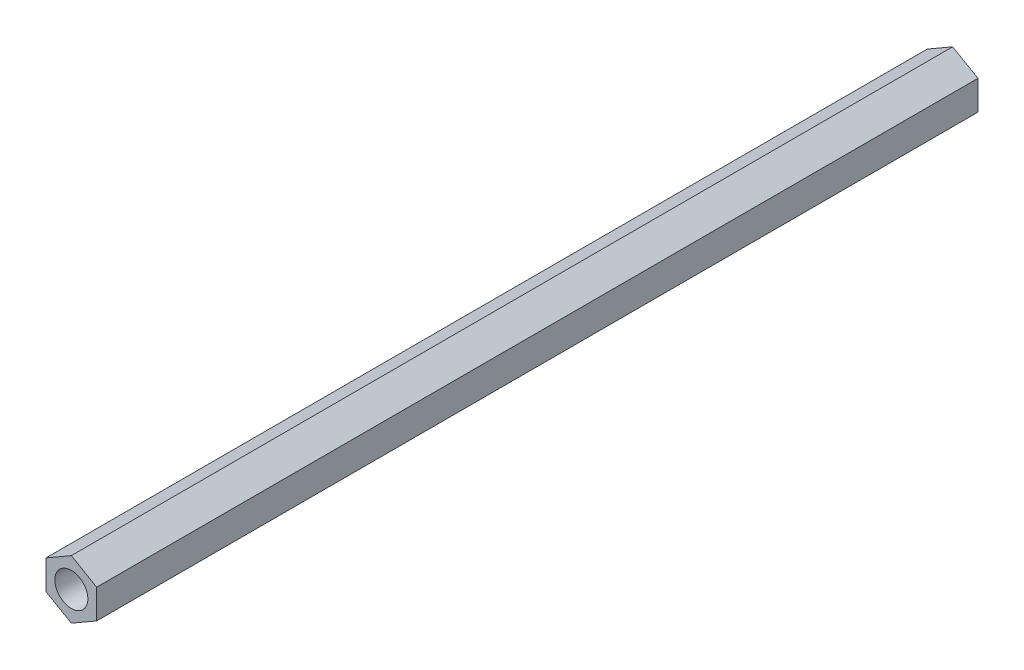
ISO-10303-21;
HEADER;
FILE_DESCRIPTION(('STEP AP214'),'2;1');
FILE_NAME('part.step','',(''),(''),'','','');
FILE_SCHEMA(('AUTOMOTIVE_DESIGN { 1 0 10303 214 1 1 1 1 }'));
ENDSEC;
DATA;
#1=APPLICATION_CONTEXT('core data for automotive mechanical design processes');
#2=APPLICATION_PROTOCOL_DEFINITION('international standard','automotive_design',2000,#1);
#3=PRODUCT_CONTEXT('',#1,'mechanical');
#4=PRODUCT('Part','Part','',(#3));
#5=PRODUCT_RELATED_PRODUCT_CATEGORY('part','',(#4));
#6=PRODUCT_DEFINITION_FORMATION('','',#4);
#7=PRODUCT_DEFINITION_CONTEXT('part definition',#1,'design');
#8=PRODUCT_DEFINITION('design','',#6,#7);
#9=PRODUCT_DEFINITION_SHAPE('','',#8);
#10=(LENGTH_UNIT() NAMED_UNIT(*) SI_UNIT(.MILLI.,.METRE.));
#11=(NAMED_UNIT(*) PLANE_ANGLE_UNIT() SI_UNIT($,.RADIAN.));
#12=(NAMED_UNIT(*) SI_UNIT($,.STERADIAN.) SOLID_ANGLE_UNIT());
#13=UNCERTAINTY_MEASURE_WITH_UNIT(LENGTH_MEASURE(1.E-05),#10,'distance_accuracy_value','');
#14=(GEOMETRIC_REPRESENTATION_CONTEXT(3) GLOBAL_UNCERTAINTY_ASSIGNED_CONTEXT((#13)) GLOBAL_UNIT_ASSIGNED_CONTEXT((#10,
#11,#12)) REPRESENTATION_CONTEXT('',''));
#15=CARTESIAN_POINT('',(0.,0.,0.));
#16=DIRECTION('',(0.,0.,1.));
#17=DIRECTION('',(1.,0.,0.));
#18=AXIS2_PLACEMENT_3D('',#15,#16,#17);
#19=CARTESIAN_POINT('',(0.,0.,80.));
#20=DIRECTION('',(0.,0.,1.));
#21=DIRECTION('',(1.,0.,0.));
#22=AXIS2_PLACEMENT_3D('',#19,#20,#21);
#23=PLANE('',#22);
#24=DIRECTION('',(-0.866025403784439,0.5,0.));
#25=VECTOR('',#24,1.);
#26=CARTESIAN_POINT('',(2.3,1.32790561913614,80.));
#27=LINE('',#26,#25);
#28=CARTESIAN_POINT('',(2.3,1.32790561913614,80.));
#29=VERTEX_POINT('',#28);
#30=CARTESIAN_POINT('',(0.,2.65581123827228,80.));
#31=VERTEX_POINT('',#30);
#32=EDGE_CURVE('E130',#29,#31,#27,.T.);
#33=ORIENTED_EDGE('',*,*,#32,.T.);
#34=DIRECTION('',(-0.866025403784439,-0.5,0.));
#35=VECTOR('',#34,1.);
#36=CARTESIAN_POINT('',(0.,2.65581123827228,80.));
#37=LINE('',#36,#35);
#38=CARTESIAN_POINT('',(-2.3,1.32790561913614,80.));
#39=VERTEX_POINT('',#38);
#40=EDGE_CURVE('E88',#31,#39,#37,.T.);
#41=ORIENTED_EDGE('',*,*,#40,.T.);
#42=DIRECTION('',(0.,-1.,0.));
#43=VECTOR('',#42,1.);
#44=CARTESIAN_POINT('',(-2.3,1.32790561913614,80.));
#45=LINE('',#44,#43);
#46=CARTESIAN_POINT('',(-2.3,-1.32790561913614,80.));
#47=VERTEX_POINT('',#46);
#48=EDGE_CURVE('E101',#39,#47,#45,.T.);
#49=ORIENTED_EDGE('',*,*,#48,.T.);
#50=DIRECTION('',(0.866025403784438,-0.5,0.));
#51=VECTOR('',#50,1.);
#52=CARTESIAN_POINT('',(-2.3,-1.32790561913614,80.));
#53=LINE('',#52,#51);
#54=CARTESIAN_POINT('',(0.,-2.65581123827228,80.));
#55=VERTEX_POINT('',#54);
#56=EDGE_CURVE('E95',#47,#55,#53,.T.);
#57=ORIENTED_EDGE('',*,*,#56,.T.);
#58=DIRECTION('',(0.866025403784439,0.5,0.));
#59=VECTOR('',#58,1.);
#60=CARTESIAN_POINT('',(0.,-2.65581123827228,80.));
#61=LINE('',#60,#59);
#62=CARTESIAN_POINT('',(2.3,-1.32790561913614,80.));
#63=VERTEX_POINT('',#62);
#64=EDGE_CURVE('E99',#55,#63,#61,.T.);
#65=ORIENTED_EDGE('',*,*,#64,.T.);
#66=DIRECTION('',(0.,1.,0.));
#67=VECTOR('',#66,1.);
#68=CARTESIAN_POINT('',(2.3,-1.32790561913614,80.));
#69=LINE('',#68,#67);
#70=EDGE_CURVE('E51',#63,#29,#69,.T.);
#71=ORIENTED_EDGE('',*,*,#70,.T.);
#72=EDGE_LOOP('',(#33,#41,#49,#57,#65,#71));
#73=FACE_BOUND('',#72,.T.);
#74=CARTESIAN_POINT('',(0.,0.,80.));
#75=DIRECTION('',(0.,0.,1.));
#76=DIRECTION('',(1.,0.,0.));
#77=AXIS2_PLACEMENT_3D('',#74,#75,#76);
#78=CIRCLE('',#77,1.5);
#79=CARTESIAN_POINT('',(1.5,0.,80.));
#80=VERTEX_POINT('',#79);
#81=EDGE_CURVE('E123',#80,#80,#78,.T.);
#82=ORIENTED_EDGE('',*,*,#81,.F.);
#83=EDGE_LOOP('',(#82));
#84=FACE_BOUND('',#83,.T.);
#85=ADVANCED_FACE('F34',(#73,#84),#23,.T.);
#86=CARTESIAN_POINT('',(0.,0.,0.));
#87=DIRECTION('',(0.,0.,1.));
#88=DIRECTION('',(1.,0.,0.));
#89=AXIS2_PLACEMENT_3D('',#86,#87,#88);
#90=PLANE('',#89);
#91=DIRECTION('',(-0.866025403784439,0.5,0.));
#92=VECTOR('',#91,1.);
#93=CARTESIAN_POINT('',(2.3,1.32790561913614,0.));
#94=LINE('',#93,#92);
#95=CARTESIAN_POINT('',(2.3,1.32790561913614,0.));
#96=VERTEX_POINT('',#95);
#97=CARTESIAN_POINT('',(0.,2.65581123827228,0.));
#98=VERTEX_POINT('',#97);
#99=EDGE_CURVE('E119',#96,#98,#94,.T.);
#100=ORIENTED_EDGE('',*,*,#99,.F.);
#101=DIRECTION('',(0.,1.,0.));
#102=VECTOR('',#101,1.);
#103=CARTESIAN_POINT('',(2.3,-1.32790561913614,0.));
#104=LINE('',#103,#102);
#105=CARTESIAN_POINT('',(2.3,-1.32790561913614,0.));
#106=VERTEX_POINT('',#105);
#107=EDGE_CURVE('E80',#106,#96,#104,.T.);
#108=ORIENTED_EDGE('',*,*,#107,.F.);
#109=DIRECTION('',(0.866025403784439,0.5,0.));
#110=VECTOR('',#109,1.);
#111=CARTESIAN_POINT('',(0.,-2.65581123827228,0.));
#112=LINE('',#111,#110);
#113=CARTESIAN_POINT('',(0.,-2.65581123827228,0.));
#114=VERTEX_POINT('',#113);
#115=EDGE_CURVE('E74',#114,#106,#112,.T.);
#116=ORIENTED_EDGE('',*,*,#115,.F.);
#117=DIRECTION('',(0.866025403784438,-0.5,0.));
#118=VECTOR('',#117,1.);
#119=CARTESIAN_POINT('',(-2.3,-1.32790561913614,0.));
#120=LINE('',#119,#118);
#121=CARTESIAN_POINT('',(-2.3,-1.32790561913614,0.));
#122=VERTEX_POINT('',#121);
#123=EDGE_CURVE('E109',#122,#114,#120,.T.);
#124=ORIENTED_EDGE('',*,*,#123,.F.);
#125=DIRECTION('',(0.,-1.,0.));
#126=VECTOR('',#125,1.);
#127=CARTESIAN_POINT('',(-2.3,1.32790561913614,0.));
#128=LINE('',#127,#126);
#129=CARTESIAN_POINT('',(-2.3,1.32790561913614,0.));
#130=VERTEX_POINT('',#129);
#131=EDGE_CURVE('E125',#130,#122,#128,.T.);
#132=ORIENTED_EDGE('',*,*,#131,.F.);
#133=DIRECTION('',(-0.866025403784439,-0.5,0.));
#134=VECTOR('',#133,1.);
#135=CARTESIAN_POINT('',(0.,2.65581123827228,0.));
#136=LINE('',#135,#134);
#137=EDGE_CURVE('E122',#98,#130,#136,.T.);
#138=ORIENTED_EDGE('',*,*,#137,.F.);
#139=EDGE_LOOP('',(#100,#108,#116,#124,#132,#138));
#140=FACE_BOUND('',#139,.T.);
#141=CARTESIAN_POINT('',(0.,0.,0.));
#142=DIRECTION('',(0.,0.,1.));
#143=DIRECTION('',(1.,0.,0.));
#144=AXIS2_PLACEMENT_3D('',#141,#142,#143);
#145=CIRCLE('',#144,1.5);
#146=CARTESIAN_POINT('',(1.5,0.,0.));
#147=VERTEX_POINT('',#146);
#148=EDGE_CURVE('E241',#147,#147,#145,.T.);
#149=ORIENTED_EDGE('',*,*,#148,.T.);
#150=EDGE_LOOP('',(#149));
#151=FACE_BOUND('',#150,.T.);
#152=ADVANCED_FACE('F139',(#140,#151),#90,.F.);
#153=CARTESIAN_POINT('',(2.3,1.32790561913614,80.));
#154=DIRECTION('',(-0.5,-0.866025403784439,0.));
#155=DIRECTION('',(0.866025403784439,-0.5,0.));
#156=AXIS2_PLACEMENT_3D('',#153,#154,#155);
#157=PLANE('',#156);
#158=ORIENTED_EDGE('',*,*,#99,.T.);
#159=DIRECTION('',(0.,0.,-1.));
#160=VECTOR('',#159,1.);
#161=CARTESIAN_POINT('',(0.,2.65581123827228,80.));
#162=LINE('',#161,#160);
#163=EDGE_CURVE('E11',#31,#98,#162,.T.);
#164=ORIENTED_EDGE('',*,*,#163,.F.);
#165=ORIENTED_EDGE('',*,*,#32,.F.);
#166=DIRECTION('',(0.,0.,-1.));
#167=VECTOR('',#166,1.);
#168=CARTESIAN_POINT('',(2.3,1.32790561913614,80.));
#169=LINE('',#168,#167);
#170=EDGE_CURVE('E115',#29,#96,#169,.T.);
#171=ORIENTED_EDGE('',*,*,#170,.T.);
#172=EDGE_LOOP('',(#158,#164,#165,#171));
#173=FACE_BOUND('',#172,.T.);
#174=ADVANCED_FACE('F36',(#173),#157,.F.);
#175=CARTESIAN_POINT('',(0.,2.65581123827228,80.));
#176=DIRECTION('',(0.5,-0.866025403784439,0.));
#177=DIRECTION('',(0.866025403784439,0.5,0.));
#178=AXIS2_PLACEMENT_3D('',#175,#176,#177);
#179=PLANE('',#178);
#180=ORIENTED_EDGE('',*,*,#137,.T.);
#181=DIRECTION('',(0.,0.,-1.));
#182=VECTOR('',#181,1.);
#183=CARTESIAN_POINT('',(-2.3,1.32790561913614,80.));
#184=LINE('',#183,#182);
#185=EDGE_CURVE('E43',#39,#130,#184,.T.);
#186=ORIENTED_EDGE('',*,*,#185,.F.);
#187=ORIENTED_EDGE('',*,*,#40,.F.);
#188=ORIENTED_EDGE('',*,*,#163,.T.);
#189=EDGE_LOOP('',(#180,#186,#187,#188));
#190=FACE_BOUND('',#189,.T.);
#191=ADVANCED_FACE('F164',(#190),#179,.F.);
#192=CARTESIAN_POINT('',(-2.3,1.32790561913614,80.));
#193=DIRECTION('',(1.,0.,0.));
#194=DIRECTION('',(0.,0.,-1.));
#195=AXIS2_PLACEMENT_3D('',#192,#193,#194);
#196=PLANE('',#195);
#197=ORIENTED_EDGE('',*,*,#131,.T.);
#198=DIRECTION('',(0.,0.,-1.));
#199=VECTOR('',#198,1.);
#200=CARTESIAN_POINT('',(-2.3,-1.32790561913614,80.));
#201=LINE('',#200,#199);
#202=EDGE_CURVE('E110',#47,#122,#201,.T.);
#203=ORIENTED_EDGE('',*,*,#202,.F.);
#204=ORIENTED_EDGE('',*,*,#48,.F.);
#205=ORIENTED_EDGE('',*,*,#185,.T.);
#206=EDGE_LOOP('',(#197,#203,#204,#205));
#207=FACE_BOUND('',#206,.T.);
#208=ADVANCED_FACE('F136',(#207),#196,.F.);
#209=CARTESIAN_POINT('',(-2.3,-1.32790561913614,80.));
#210=DIRECTION('',(0.5,0.866025403784439,0.));
#211=DIRECTION('',(-0.866025403784439,0.5,0.));
#212=AXIS2_PLACEMENT_3D('',#209,#210,#211);
#213=PLANE('',#212);
#214=ORIENTED_EDGE('',*,*,#123,.T.);
#215=DIRECTION('',(0.,0.,-1.));
#216=VECTOR('',#215,1.);
#217=CARTESIAN_POINT('',(0.,-2.65581123827228,80.));
#218=LINE('',#217,#216);
#219=EDGE_CURVE('E106',#55,#114,#218,.T.);
#220=ORIENTED_EDGE('',*,*,#219,.F.);
#221=ORIENTED_EDGE('',*,*,#56,.F.);
#222=ORIENTED_EDGE('',*,*,#202,.T.);
#223=EDGE_LOOP('',(#214,#220,#221,#222));
#224=FACE_BOUND('',#223,.T.);
#225=ADVANCED_FACE('F107',(#224),#213,.F.);
#226=CARTESIAN_POINT('',(0.,-2.65581123827228,80.));
#227=DIRECTION('',(-0.5,0.866025403784439,0.));
#228=DIRECTION('',(-0.866025403784439,-0.5,0.));
#229=AXIS2_PLACEMENT_3D('',#226,#227,#228);
#230=PLANE('',#229);
#231=ORIENTED_EDGE('',*,*,#115,.T.);
#232=DIRECTION('',(0.,0.,-1.));
#233=VECTOR('',#232,1.);
#234=CARTESIAN_POINT('',(2.3,-1.32790561913614,80.));
#235=LINE('',#234,#233);
#236=EDGE_CURVE('E111',#63,#106,#235,.T.);
#237=ORIENTED_EDGE('',*,*,#236,.F.);
#238=ORIENTED_EDGE('',*,*,#64,.F.);
#239=ORIENTED_EDGE('',*,*,#219,.T.);
#240=EDGE_LOOP('',(#231,#237,#238,#239));
#241=FACE_BOUND('',#240,.T.);
#242=ADVANCED_FACE('F113',(#241),#230,.F.);
#243=CARTESIAN_POINT('',(2.3,-1.32790561913614,80.));
#244=DIRECTION('',(-1.,0.,0.));
#245=DIRECTION('',(0.,0.,1.));
#246=AXIS2_PLACEMENT_3D('',#243,#244,#245);
#247=PLANE('',#246);
#248=ORIENTED_EDGE('',*,*,#107,.T.);
#249=ORIENTED_EDGE('',*,*,#170,.F.);
#250=ORIENTED_EDGE('',*,*,#70,.F.);
#251=ORIENTED_EDGE('',*,*,#236,.T.);
#252=EDGE_LOOP('',(#248,#249,#250,#251));
#253=FACE_BOUND('',#252,.T.);
#254=ADVANCED_FACE('F144',(#253),#247,.F.);
#255=CARTESIAN_POINT('',(0.,0.,80.));
#256=DIRECTION('',(0.,0.,-1.));
#257=DIRECTION('',(-1.,0.,0.));
#258=AXIS2_PLACEMENT_3D('',#255,#256,#257);
#259=CYLINDRICAL_SURFACE('',#258,1.5);
#260=ORIENTED_EDGE('',*,*,#81,.T.);
#261=EDGE_LOOP('',(#260));
#262=FACE_BOUND('',#261,.T.);
#263=ORIENTED_EDGE('',*,*,#148,.F.);
#264=EDGE_LOOP('',(#263));
#265=FACE_BOUND('',#264,.T.);
#266=ADVANCED_FACE('F146',(#262,#265),#259,.F.);
#267=CLOSED_SHELL('',(#85,#152,#174,#191,#208,#225,#242,#254,#266));
#268=MANIFOLD_SOLID_BREP('B2',#267);
#269=ADVANCED_BREP_SHAPE_REPRESENTATION('',(#18,#268),#14);
#270=SHAPE_DEFINITION_REPRESENTATION(#9,#269);
ENDSEC;
END-ISO-10303-21;
